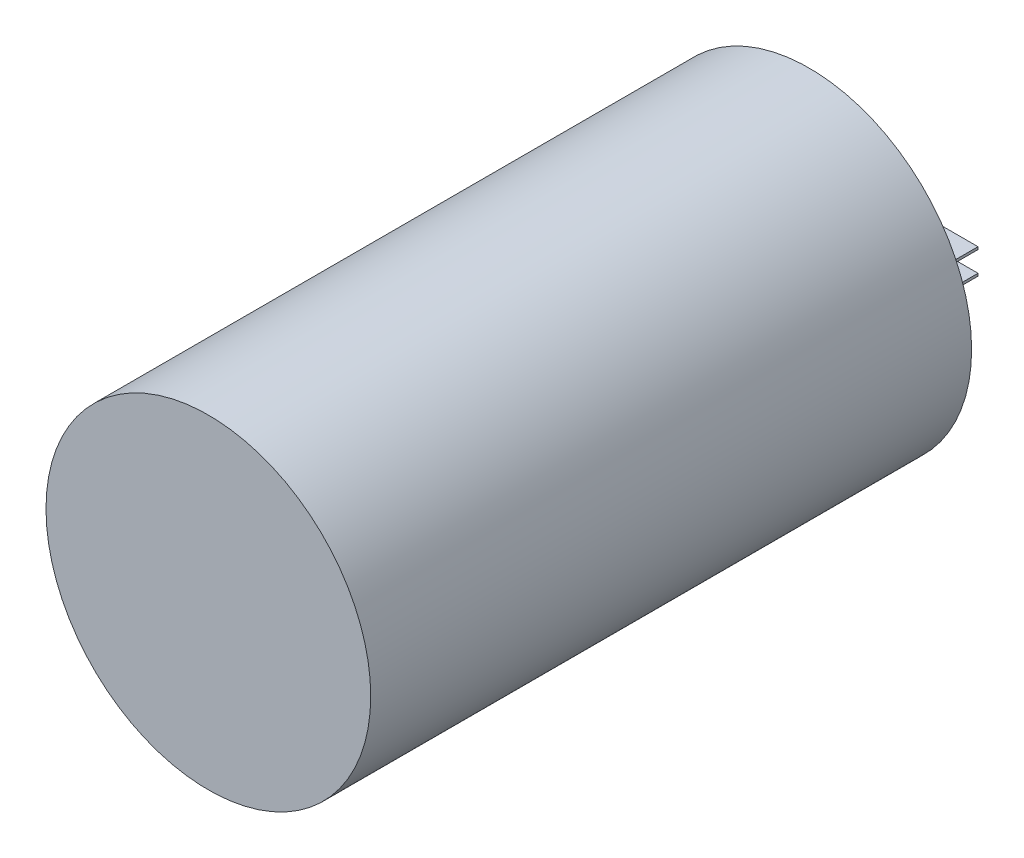
ISO-10303-21;
HEADER;
FILE_DESCRIPTION(('STEP AP214'),'2;1');
FILE_NAME('part.step','',(''),(''),'','','');
FILE_SCHEMA(('AUTOMOTIVE_DESIGN { 1 0 10303 214 1 1 1 1 }'));
ENDSEC;
DATA;
#1=APPLICATION_CONTEXT('core data for automotive mechanical design processes');
#2=APPLICATION_PROTOCOL_DEFINITION('international standard','automotive_design',2000,#1);
#3=PRODUCT_CONTEXT('',#1,'mechanical');
#4=PRODUCT('Part','Part','',(#3));
#5=PRODUCT_RELATED_PRODUCT_CATEGORY('part','',(#4));
#6=PRODUCT_DEFINITION_FORMATION('','',#4);
#7=PRODUCT_DEFINITION_CONTEXT('part definition',#1,'design');
#8=PRODUCT_DEFINITION('design','',#6,#7);
#9=PRODUCT_DEFINITION_SHAPE('','',#8);
#10=(LENGTH_UNIT() NAMED_UNIT(*) SI_UNIT(.MILLI.,.METRE.));
#11=(NAMED_UNIT(*) PLANE_ANGLE_UNIT() SI_UNIT($,.RADIAN.));
#12=(NAMED_UNIT(*) SI_UNIT($,.STERADIAN.) SOLID_ANGLE_UNIT());
#13=UNCERTAINTY_MEASURE_WITH_UNIT(LENGTH_MEASURE(1.E-05),#10,'distance_accuracy_value','');
#14=(GEOMETRIC_REPRESENTATION_CONTEXT(3) GLOBAL_UNCERTAINTY_ASSIGNED_CONTEXT((#13)) GLOBAL_UNIT_ASSIGNED_CONTEXT((#10,
#11,#12)) REPRESENTATION_CONTEXT('',''));
#15=CARTESIAN_POINT('',(0.,0.,0.));
#16=DIRECTION('',(0.,0.,1.));
#17=DIRECTION('',(1.,0.,0.));
#18=AXIS2_PLACEMENT_3D('',#15,#16,#17);
#19=CARTESIAN_POINT('',(7.,1.,-6.2));
#20=DIRECTION('',(-1.,0.,0.));
#21=DIRECTION('',(0.,0.,1.));
#22=AXIS2_PLACEMENT_3D('',#19,#20,#21);
#23=PLANE('',#22);
#24=DIRECTION('',(0.,-1.,0.));
#25=VECTOR('',#24,1.);
#26=CARTESIAN_POINT('',(7.,1.,0.));
#27=LINE('',#26,#25);
#28=CARTESIAN_POINT('',(7.,1.,0.));
#29=VERTEX_POINT('',#28);
#30=CARTESIAN_POINT('',(7.,0.8,0.));
#31=VERTEX_POINT('',#30);
#32=EDGE_CURVE('E115',#29,#31,#27,.T.);
#33=ORIENTED_EDGE('',*,*,#32,.T.);
#34=DIRECTION('',(0.,0.,-1.));
#35=VECTOR('',#34,1.);
#36=CARTESIAN_POINT('',(7.,0.8,0.));
#37=LINE('',#36,#35);
#38=CARTESIAN_POINT('',(7.,0.8,-6.2));
#39=VERTEX_POINT('',#38);
#40=EDGE_CURVE('E116',#31,#39,#37,.T.);
#41=ORIENTED_EDGE('',*,*,#40,.T.);
#42=DIRECTION('',(0.,-1.,0.));
#43=VECTOR('',#42,1.);
#44=CARTESIAN_POINT('',(7.,1.,-6.2));
#45=LINE('',#44,#43);
#46=CARTESIAN_POINT('',(7.,1.,-6.2));
#47=VERTEX_POINT('',#46);
#48=EDGE_CURVE('E162',#47,#39,#45,.T.);
#49=ORIENTED_EDGE('',*,*,#48,.F.);
#50=DIRECTION('',(0.,0.,1.));
#51=VECTOR('',#50,1.);
#52=CARTESIAN_POINT('',(7.,1.,-6.2));
#53=LINE('',#52,#51);
#54=EDGE_CURVE('E133',#47,#29,#53,.T.);
#55=ORIENTED_EDGE('',*,*,#54,.T.);
#56=EDGE_LOOP('',(#33,#41,#49,#55));
#57=FACE_BOUND('',#56,.T.);
#58=ADVANCED_FACE('F33',(#57),#23,.F.);
#59=CARTESIAN_POINT('',(-7.,1.,-6.2));
#60=DIRECTION('',(1.,0.,0.));
#61=DIRECTION('',(0.,1.,0.));
#62=AXIS2_PLACEMENT_3D('',#59,#60,#61);
#63=PLANE('',#62);
#64=DIRECTION('',(0.,1.,0.));
#65=VECTOR('',#64,1.);
#66=CARTESIAN_POINT('',(-7.,1.,-6.2));
#67=LINE('',#66,#65);
#68=CARTESIAN_POINT('',(-7.,0.8,-6.2));
#69=VERTEX_POINT('',#68);
#70=CARTESIAN_POINT('',(-7.,1.,-6.2));
#71=VERTEX_POINT('',#70);
#72=EDGE_CURVE('E167',#69,#71,#67,.T.);
#73=ORIENTED_EDGE('',*,*,#72,.F.);
#74=DIRECTION('',(0.,0.,-1.));
#75=VECTOR('',#74,1.);
#76=CARTESIAN_POINT('',(-7.,0.8,0.));
#77=LINE('',#76,#75);
#78=CARTESIAN_POINT('',(-7.,0.8,0.));
#79=VERTEX_POINT('',#78);
#80=EDGE_CURVE('E120',#79,#69,#77,.T.);
#81=ORIENTED_EDGE('',*,*,#80,.F.);
#82=DIRECTION('',(0.,1.,0.));
#83=VECTOR('',#82,1.);
#84=CARTESIAN_POINT('',(-7.,1.,0.));
#85=LINE('',#84,#83);
#86=CARTESIAN_POINT('',(-7.,1.,0.));
#87=VERTEX_POINT('',#86);
#88=EDGE_CURVE('E127',#79,#87,#85,.T.);
#89=ORIENTED_EDGE('',*,*,#88,.T.);
#90=DIRECTION('',(0.,0.,1.));
#91=VECTOR('',#90,1.);
#92=CARTESIAN_POINT('',(-7.,1.,-6.2));
#93=LINE('',#92,#91);
#94=EDGE_CURVE('E136',#71,#87,#93,.T.);
#95=ORIENTED_EDGE('',*,*,#94,.F.);
#96=EDGE_LOOP('',(#73,#81,#89,#95));
#97=FACE_BOUND('',#96,.T.);
#98=ADVANCED_FACE('F177',(#97),#63,.F.);
#99=CARTESIAN_POINT('',(7.,-1.,-6.2));
#100=DIRECTION('',(0.,0.,-1.));
#101=DIRECTION('',(-1.,0.,0.));
#102=AXIS2_PLACEMENT_3D('',#99,#100,#101);
#103=PLANE('',#102);
#104=DIRECTION('',(1.,0.,0.));
#105=VECTOR('',#104,1.);
#106=CARTESIAN_POINT('',(7.,0.8,-6.2));
#107=LINE('',#106,#105);
#108=EDGE_CURVE('E104',#69,#39,#107,.T.);
#109=ORIENTED_EDGE('',*,*,#108,.F.);
#110=ORIENTED_EDGE('',*,*,#72,.T.);
#111=DIRECTION('',(1.,0.,0.));
#112=VECTOR('',#111,1.);
#113=CARTESIAN_POINT('',(7.,1.,-6.2));
#114=LINE('',#113,#112);
#115=EDGE_CURVE('E124',#71,#47,#114,.T.);
#116=ORIENTED_EDGE('',*,*,#115,.T.);
#117=ORIENTED_EDGE('',*,*,#48,.T.);
#118=EDGE_LOOP('',(#109,#110,#116,#117));
#119=FACE_BOUND('',#118,.T.);
#120=ADVANCED_FACE('F150',(#119),#103,.T.);
#121=CARTESIAN_POINT('',(0.,0.,0.));
#122=DIRECTION('',(0.,0.,1.));
#123=DIRECTION('',(1.,0.,0.));
#124=AXIS2_PLACEMENT_3D('',#121,#122,#123);
#125=PLANE('',#124);
#126=CARTESIAN_POINT('',(7.,-0.8,0.));
#127=VERTEX_POINT('',#126);
#128=CARTESIAN_POINT('',(7.,-1.,0.));
#129=VERTEX_POINT('',#128);
#130=EDGE_CURVE('E55',#127,#129,#27,.T.);
#131=ORIENTED_EDGE('',*,*,#130,.F.);
#132=DIRECTION('',(-1.,0.,0.));
#133=VECTOR('',#132,1.);
#134=CARTESIAN_POINT('',(7.,-0.8,0.));
#135=LINE('',#134,#133);
#136=CARTESIAN_POINT('',(-7.,-0.8,0.));
#137=VERTEX_POINT('',#136);
#138=EDGE_CURVE('E97',#127,#137,#135,.T.);
#139=ORIENTED_EDGE('',*,*,#138,.T.);
#140=CARTESIAN_POINT('',(-7.,-1.,0.));
#141=VERTEX_POINT('',#140);
#142=EDGE_CURVE('E128',#141,#137,#85,.T.);
#143=ORIENTED_EDGE('',*,*,#142,.F.);
#144=DIRECTION('',(-1.,0.,0.));
#145=VECTOR('',#144,1.);
#146=CARTESIAN_POINT('',(7.,-1.,0.));
#147=LINE('',#146,#145);
#148=EDGE_CURVE('E113',#129,#141,#147,.T.);
#149=ORIENTED_EDGE('',*,*,#148,.F.);
#150=EDGE_LOOP('',(#131,#139,#143,#149));
#151=FACE_BOUND('',#150,.T.);
#152=CARTESIAN_POINT('',(0.,0.,0.));
#153=DIRECTION('',(0.,0.,1.));
#154=DIRECTION('',(1.,0.,0.));
#155=AXIS2_PLACEMENT_3D('',#152,#153,#154);
#156=CIRCLE('',#155,12.7);
#157=CARTESIAN_POINT('',(12.7,0.,0.));
#158=VERTEX_POINT('',#157);
#159=EDGE_CURVE('E37',#158,#158,#156,.T.);
#160=ORIENTED_EDGE('',*,*,#159,.F.);
#161=EDGE_LOOP('',(#160));
#162=FACE_BOUND('',#161,.T.);
#163=ORIENTED_EDGE('',*,*,#32,.F.);
#164=DIRECTION('',(1.,0.,0.));
#165=VECTOR('',#164,1.);
#166=CARTESIAN_POINT('',(7.,1.,0.));
#167=LINE('',#166,#165);
#168=EDGE_CURVE('E130',#87,#29,#167,.T.);
#169=ORIENTED_EDGE('',*,*,#168,.F.);
#170=ORIENTED_EDGE('',*,*,#88,.F.);
#171=DIRECTION('',(1.,0.,0.));
#172=VECTOR('',#171,1.);
#173=CARTESIAN_POINT('',(7.,0.8,0.));
#174=LINE('',#173,#172);
#175=EDGE_CURVE('E103',#79,#31,#174,.T.);
#176=ORIENTED_EDGE('',*,*,#175,.T.);
#177=EDGE_LOOP('',(#163,#169,#170,#176));
#178=FACE_BOUND('',#177,.T.);
#179=ADVANCED_FACE('F110',(#151,#162,#178),#125,.F.);
#180=CARTESIAN_POINT('',(0.,0.,47.));
#181=DIRECTION('',(0.,0.,-1.));
#182=DIRECTION('',(-1.,0.,0.));
#183=AXIS2_PLACEMENT_3D('',#180,#181,#182);
#184=CYLINDRICAL_SURFACE('',#183,12.7);
#185=CARTESIAN_POINT('',(0.,0.,47.));
#186=DIRECTION('',(0.,0.,1.));
#187=DIRECTION('',(1.,0.,0.));
#188=AXIS2_PLACEMENT_3D('',#185,#186,#187);
#189=CIRCLE('',#188,12.7);
#190=CARTESIAN_POINT('',(12.7,0.,47.));
#191=VERTEX_POINT('',#190);
#192=EDGE_CURVE('E11',#191,#191,#189,.T.);
#193=ORIENTED_EDGE('',*,*,#192,.F.);
#194=EDGE_LOOP('',(#193));
#195=FACE_BOUND('',#194,.T.);
#196=ORIENTED_EDGE('',*,*,#159,.T.);
#197=EDGE_LOOP('',(#196));
#198=FACE_BOUND('',#197,.T.);
#199=ADVANCED_FACE('F35',(#195,#198),#184,.T.);
#200=CARTESIAN_POINT('',(0.,0.,47.));
#201=DIRECTION('',(0.,0.,1.));
#202=DIRECTION('',(1.,0.,0.));
#203=AXIS2_PLACEMENT_3D('',#200,#201,#202);
#204=PLANE('',#203);
#205=ORIENTED_EDGE('',*,*,#192,.T.);
#206=EDGE_LOOP('',(#205));
#207=FACE_BOUND('',#206,.T.);
#208=ADVANCED_FACE('F209',(#207),#204,.T.);
#209=CARTESIAN_POINT('',(7.,-0.8,-6.2));
#210=VERTEX_POINT('',#209);
#211=CARTESIAN_POINT('',(7.,-1.,-6.2));
#212=VERTEX_POINT('',#211);
#213=EDGE_CURVE('E108',#210,#212,#45,.T.);
#214=ORIENTED_EDGE('',*,*,#213,.F.);
#215=DIRECTION('',(0.,0.,-1.));
#216=VECTOR('',#215,1.);
#217=CARTESIAN_POINT('',(7.,-0.8,0.));
#218=LINE('',#217,#216);
#219=EDGE_CURVE('E48',#127,#210,#218,.T.);
#220=ORIENTED_EDGE('',*,*,#219,.F.);
#221=ORIENTED_EDGE('',*,*,#130,.T.);
#222=DIRECTION('',(0.,0.,1.));
#223=VECTOR('',#222,1.);
#224=CARTESIAN_POINT('',(7.,-1.,-6.2));
#225=LINE('',#224,#223);
#226=EDGE_CURVE('E142',#212,#129,#225,.T.);
#227=ORIENTED_EDGE('',*,*,#226,.F.);
#228=EDGE_LOOP('',(#214,#220,#221,#227));
#229=FACE_BOUND('',#228,.T.);
#230=ADVANCED_FACE('F107',(#229),#23,.F.);
#231=CARTESIAN_POINT('',(7.,-1.,-6.2));
#232=DIRECTION('',(0.,1.,0.));
#233=DIRECTION('',(0.,0.,1.));
#234=AXIS2_PLACEMENT_3D('',#231,#232,#233);
#235=PLANE('',#234);
#236=ORIENTED_EDGE('',*,*,#148,.T.);
#237=DIRECTION('',(0.,0.,1.));
#238=VECTOR('',#237,1.);
#239=CARTESIAN_POINT('',(-7.,-1.,-6.2));
#240=LINE('',#239,#238);
#241=CARTESIAN_POINT('',(-7.,-1.,-6.2));
#242=VERTEX_POINT('',#241);
#243=EDGE_CURVE('E139',#242,#141,#240,.T.);
#244=ORIENTED_EDGE('',*,*,#243,.F.);
#245=DIRECTION('',(-1.,0.,0.));
#246=VECTOR('',#245,1.);
#247=CARTESIAN_POINT('',(7.,-1.,-6.2));
#248=LINE('',#247,#246);
#249=EDGE_CURVE('E165',#212,#242,#248,.T.);
#250=ORIENTED_EDGE('',*,*,#249,.F.);
#251=ORIENTED_EDGE('',*,*,#226,.T.);
#252=EDGE_LOOP('',(#236,#244,#250,#251));
#253=FACE_BOUND('',#252,.T.);
#254=ADVANCED_FACE('F187',(#253),#235,.F.);
#255=ORIENTED_EDGE('',*,*,#142,.T.);
#256=DIRECTION('',(0.,0.,-1.));
#257=VECTOR('',#256,1.);
#258=CARTESIAN_POINT('',(-7.,-0.8,0.));
#259=LINE('',#258,#257);
#260=CARTESIAN_POINT('',(-7.,-0.8,-6.2));
#261=VERTEX_POINT('',#260);
#262=EDGE_CURVE('E100',#137,#261,#259,.T.);
#263=ORIENTED_EDGE('',*,*,#262,.T.);
#264=EDGE_CURVE('E170',#242,#261,#67,.T.);
#265=ORIENTED_EDGE('',*,*,#264,.F.);
#266=ORIENTED_EDGE('',*,*,#243,.T.);
#267=EDGE_LOOP('',(#255,#263,#265,#266));
#268=FACE_BOUND('',#267,.T.);
#269=ADVANCED_FACE('F185',(#268),#63,.F.);
#270=CARTESIAN_POINT('',(7.,1.,-6.2));
#271=DIRECTION('',(0.,-1.,0.));
#272=DIRECTION('',(0.,0.,-1.));
#273=AXIS2_PLACEMENT_3D('',#270,#271,#272);
#274=PLANE('',#273);
#275=ORIENTED_EDGE('',*,*,#168,.T.);
#276=ORIENTED_EDGE('',*,*,#54,.F.);
#277=ORIENTED_EDGE('',*,*,#115,.F.);
#278=ORIENTED_EDGE('',*,*,#94,.T.);
#279=EDGE_LOOP('',(#275,#276,#277,#278));
#280=FACE_BOUND('',#279,.T.);
#281=ADVANCED_FACE('F157',(#280),#274,.F.);
#282=DIRECTION('',(-1.,0.,0.));
#283=VECTOR('',#282,1.);
#284=CARTESIAN_POINT('',(7.,-0.8,-6.2));
#285=LINE('',#284,#283);
#286=EDGE_CURVE('E182',#210,#261,#285,.T.);
#287=ORIENTED_EDGE('',*,*,#286,.F.);
#288=ORIENTED_EDGE('',*,*,#213,.T.);
#289=ORIENTED_EDGE('',*,*,#249,.T.);
#290=ORIENTED_EDGE('',*,*,#264,.T.);
#291=EDGE_LOOP('',(#287,#288,#289,#290));
#292=FACE_BOUND('',#291,.T.);
#293=ADVANCED_FACE('F188',(#292),#103,.T.);
#294=CARTESIAN_POINT('',(7.,0.8,0.));
#295=DIRECTION('',(0.,1.,0.));
#296=DIRECTION('',(0.,0.,1.));
#297=AXIS2_PLACEMENT_3D('',#294,#295,#296);
#298=PLANE('',#297);
#299=ORIENTED_EDGE('',*,*,#108,.T.);
#300=ORIENTED_EDGE('',*,*,#40,.F.);
#301=ORIENTED_EDGE('',*,*,#175,.F.);
#302=ORIENTED_EDGE('',*,*,#80,.T.);
#303=EDGE_LOOP('',(#299,#300,#301,#302));
#304=FACE_BOUND('',#303,.T.);
#305=ADVANCED_FACE('F190',(#304),#298,.F.);
#306=CARTESIAN_POINT('',(7.,-0.8,0.));
#307=DIRECTION('',(0.,-1.,0.));
#308=DIRECTION('',(0.,0.,-1.));
#309=AXIS2_PLACEMENT_3D('',#306,#307,#308);
#310=PLANE('',#309);
#311=ORIENTED_EDGE('',*,*,#286,.T.);
#312=ORIENTED_EDGE('',*,*,#262,.F.);
#313=ORIENTED_EDGE('',*,*,#138,.F.);
#314=ORIENTED_EDGE('',*,*,#219,.T.);
#315=EDGE_LOOP('',(#311,#312,#313,#314));
#316=FACE_BOUND('',#315,.T.);
#317=ADVANCED_FACE('F98',(#316),#310,.F.);
#318=CLOSED_SHELL('',(#58,#98,#120,#179,#199,#208,#230,#254,#269,#281,#293,#305,#317));
#319=MANIFOLD_SOLID_BREP('B2',#318);
#320=ADVANCED_BREP_SHAPE_REPRESENTATION('',(#18,#319),#14);
#321=SHAPE_DEFINITION_REPRESENTATION(#9,#320);
ENDSEC;
END-ISO-10303-21;
